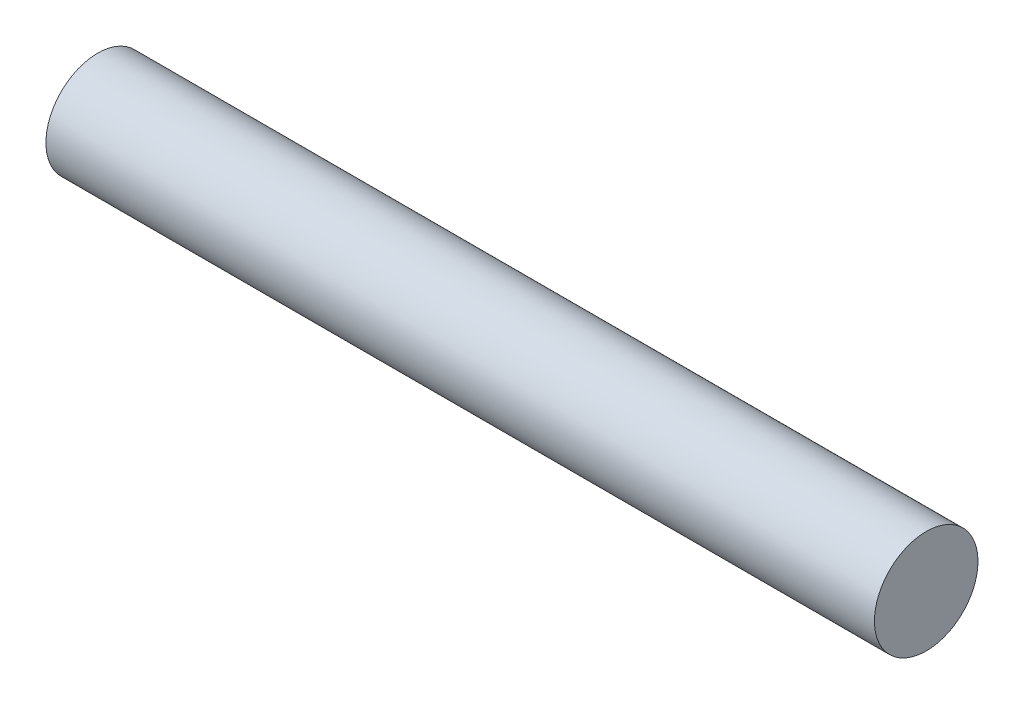
ISO-10303-21;
HEADER;
FILE_DESCRIPTION(('STEP AP214'),'2;1');
FILE_NAME('part.step','',(''),(''),'','','');
FILE_SCHEMA(('AUTOMOTIVE_DESIGN { 1 0 10303 214 1 1 1 1 }'));
ENDSEC;
DATA;
#1=APPLICATION_CONTEXT('core data for automotive mechanical design processes');
#2=APPLICATION_PROTOCOL_DEFINITION('international standard','automotive_design',2000,#1);
#3=PRODUCT_CONTEXT('',#1,'mechanical');
#4=PRODUCT('Part','Part','',(#3));
#5=PRODUCT_RELATED_PRODUCT_CATEGORY('part','',(#4));
#6=PRODUCT_DEFINITION_FORMATION('','',#4);
#7=PRODUCT_DEFINITION_CONTEXT('part definition',#1,'design');
#8=PRODUCT_DEFINITION('design','',#6,#7);
#9=PRODUCT_DEFINITION_SHAPE('','',#8);
#10=(LENGTH_UNIT() NAMED_UNIT(*) SI_UNIT(.MILLI.,.METRE.));
#11=(NAMED_UNIT(*) PLANE_ANGLE_UNIT() SI_UNIT($,.RADIAN.));
#12=(NAMED_UNIT(*) SI_UNIT($,.STERADIAN.) SOLID_ANGLE_UNIT());
#13=UNCERTAINTY_MEASURE_WITH_UNIT(LENGTH_MEASURE(1.E-05),#10,'distance_accuracy_value','');
#14=(GEOMETRIC_REPRESENTATION_CONTEXT(3) GLOBAL_UNCERTAINTY_ASSIGNED_CONTEXT((#13)) GLOBAL_UNIT_ASSIGNED_CONTEXT((#10,
#11,#12)) REPRESENTATION_CONTEXT('',''));
#15=CARTESIAN_POINT('',(0.,0.,0.));
#16=DIRECTION('',(0.,0.,1.));
#17=DIRECTION('',(1.,0.,0.));
#18=AXIS2_PLACEMENT_3D('',#15,#16,#17);
#19=CARTESIAN_POINT('',(40.,0.,0.));
#20=DIRECTION('',(-1.,0.,0.));
#21=DIRECTION('',(0.,0.,1.));
#22=AXIS2_PLACEMENT_3D('',#19,#20,#21);
#23=CYLINDRICAL_SURFACE('',#22,2.5);
#24=CARTESIAN_POINT('',(40.,0.,0.));
#25=DIRECTION('',(1.,0.,0.));
#26=DIRECTION('',(0.,0.,-1.));
#27=AXIS2_PLACEMENT_3D('',#24,#25,#26);
#28=CIRCLE('',#27,2.5);
#29=CARTESIAN_POINT('',(40.,0.,-2.5));
#30=VERTEX_POINT('',#29);
#31=EDGE_CURVE('E10',#30,#30,#28,.T.);
#32=ORIENTED_EDGE('',*,*,#31,.F.);
#33=EDGE_LOOP('',(#32));
#34=FACE_BOUND('',#33,.T.);
#35=CARTESIAN_POINT('',(0.,0.,0.));
#36=DIRECTION('',(1.,0.,0.));
#37=DIRECTION('',(0.,0.,-1.));
#38=AXIS2_PLACEMENT_3D('',#35,#36,#37);
#39=CIRCLE('',#38,2.5);
#40=CARTESIAN_POINT('',(0.,0.,-2.5));
#41=VERTEX_POINT('',#40);
#42=EDGE_CURVE('E46',#41,#41,#39,.T.);
#43=ORIENTED_EDGE('',*,*,#42,.T.);
#44=EDGE_LOOP('',(#43));
#45=FACE_BOUND('',#44,.T.);
#46=ADVANCED_FACE('F43',(#34,#45),#23,.T.);
#47=CARTESIAN_POINT('',(40.,0.,0.));
#48=DIRECTION('',(1.,0.,0.));
#49=DIRECTION('',(0.,0.,-1.));
#50=AXIS2_PLACEMENT_3D('',#47,#48,#49);
#51=PLANE('',#50);
#52=ORIENTED_EDGE('',*,*,#31,.T.);
#53=EDGE_LOOP('',(#52));
#54=FACE_BOUND('',#53,.T.);
#55=ADVANCED_FACE('F60',(#54),#51,.T.);
#56=CARTESIAN_POINT('',(0.,0.,0.));
#57=DIRECTION('',(1.,0.,0.));
#58=DIRECTION('',(0.,0.,-1.));
#59=AXIS2_PLACEMENT_3D('',#56,#57,#58);
#60=PLANE('',#59);
#61=ORIENTED_EDGE('',*,*,#42,.F.);
#62=EDGE_LOOP('',(#61));
#63=FACE_BOUND('',#62,.T.);
#64=ADVANCED_FACE('F58',(#63),#60,.F.);
#65=CLOSED_SHELL('',(#46,#55,#64));
#66=MANIFOLD_SOLID_BREP('B2',#65);
#67=ADVANCED_BREP_SHAPE_REPRESENTATION('',(#18,#66),#14);
#68=SHAPE_DEFINITION_REPRESENTATION(#9,#67);
ENDSEC;
END-ISO-10303-21;
